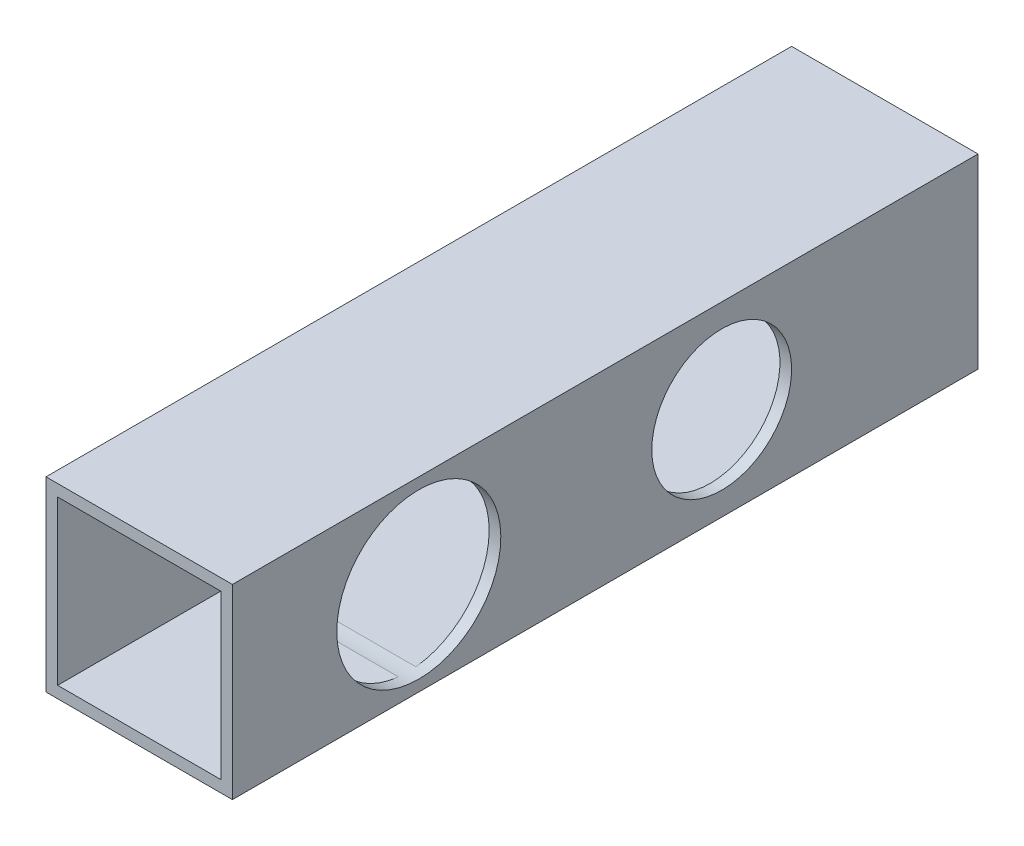
ISO-10303-21;
HEADER;
FILE_DESCRIPTION(('STEP AP214'),'2;1');
FILE_NAME('part.step','',(''),(''),'','','');
FILE_SCHEMA(('AUTOMOTIVE_DESIGN { 1 0 10303 214 1 1 1 1 }'));
ENDSEC;
DATA;
#1=APPLICATION_CONTEXT('core data for automotive mechanical design processes');
#2=APPLICATION_PROTOCOL_DEFINITION('international standard','automotive_design',2000,#1);
#3=PRODUCT_CONTEXT('',#1,'mechanical');
#4=PRODUCT('Part','Part','',(#3));
#5=PRODUCT_RELATED_PRODUCT_CATEGORY('part','',(#4));
#6=PRODUCT_DEFINITION_FORMATION('','',#4);
#7=PRODUCT_DEFINITION_CONTEXT('part definition',#1,'design');
#8=PRODUCT_DEFINITION('design','',#6,#7);
#9=PRODUCT_DEFINITION_SHAPE('','',#8);
#10=(LENGTH_UNIT() NAMED_UNIT(*) SI_UNIT(.MILLI.,.METRE.));
#11=(NAMED_UNIT(*) PLANE_ANGLE_UNIT() SI_UNIT($,.RADIAN.));
#12=(NAMED_UNIT(*) SI_UNIT($,.STERADIAN.) SOLID_ANGLE_UNIT());
#13=UNCERTAINTY_MEASURE_WITH_UNIT(LENGTH_MEASURE(1.E-05),#10,'distance_accuracy_value','');
#14=(GEOMETRIC_REPRESENTATION_CONTEXT(3) GLOBAL_UNCERTAINTY_ASSIGNED_CONTEXT((#13)) GLOBAL_UNIT_ASSIGNED_CONTEXT((#10,
#11,#12)) REPRESENTATION_CONTEXT('',''));
#15=CARTESIAN_POINT('',(0.,0.,0.));
#16=DIRECTION('',(0.,0.,1.));
#17=DIRECTION('',(1.,0.,0.));
#18=AXIS2_PLACEMENT_3D('',#15,#16,#17);
#19=CARTESIAN_POINT('',(11.1125,-11.1125,914.4));
#20=DIRECTION('',(-1.,0.,0.));
#21=DIRECTION('',(0.,0.,1.));
#22=AXIS2_PLACEMENT_3D('',#19,#20,#21);
#23=PLANE('',#22);
#24=CARTESIAN_POINT('',(11.1125,0.,-879.475));
#25=DIRECTION('',(-1.,0.,0.));
#26=DIRECTION('',(0.,0.,1.));
#27=AXIS2_PLACEMENT_3D('',#24,#25,#26);
#28=CIRCLE('',#27,9.52500000000002);
#29=CARTESIAN_POINT('',(11.1125,0.,-869.95));
#30=VERTEX_POINT('',#29);
#31=EDGE_CURVE('E363',#30,#30,#28,.T.);
#32=ORIENTED_EDGE('',*,*,#31,.F.);
#33=EDGE_LOOP('',(#32));
#34=FACE_BOUND('',#33,.T.);
#35=CARTESIAN_POINT('',(11.1125,0.,-838.2));
#36=DIRECTION('',(-1.,0.,0.));
#37=DIRECTION('',(0.,0.,1.));
#38=AXIS2_PLACEMENT_3D('',#35,#36,#37);
#39=CIRCLE('',#38,11.1759999999999);
#40=CARTESIAN_POINT('',(11.1125,11.1125,-839.389672118694));
#41=VERTEX_POINT('',#40);
#42=CARTESIAN_POINT('',(11.1125,-11.1125,-839.389672118694));
#43=VERTEX_POINT('',#42);
#44=EDGE_CURVE('E133',#41,#43,#39,.T.);
#45=ORIENTED_EDGE('',*,*,#44,.F.);
#46=DIRECTION('',(0.,0.,-1.));
#47=VECTOR('',#46,1.);
#48=CARTESIAN_POINT('',(11.1125,11.1125,914.4));
#49=LINE('',#48,#47);
#50=CARTESIAN_POINT('',(11.1125,11.1125,-914.4));
#51=VERTEX_POINT('',#50);
#52=EDGE_CURVE('E162',#41,#51,#49,.T.);
#53=ORIENTED_EDGE('',*,*,#52,.T.);
#54=DIRECTION('',(0.,1.,0.));
#55=VECTOR('',#54,1.);
#56=CARTESIAN_POINT('',(11.1125,-11.1125,-914.4));
#57=LINE('',#56,#55);
#58=CARTESIAN_POINT('',(11.1125,-11.1125,-914.4));
#59=VERTEX_POINT('',#58);
#60=EDGE_CURVE('E191',#59,#51,#57,.T.);
#61=ORIENTED_EDGE('',*,*,#60,.F.);
#62=DIRECTION('',(0.,0.,-1.));
#63=VECTOR('',#62,1.);
#64=CARTESIAN_POINT('',(11.1125,-11.1125,914.4));
#65=LINE('',#64,#63);
#66=EDGE_CURVE('E235',#43,#59,#65,.T.);
#67=ORIENTED_EDGE('',*,*,#66,.F.);
#68=EDGE_LOOP('',(#45,#53,#61,#67));
#69=FACE_BOUND('',#68,.T.);
#70=ADVANCED_FACE('F38',(#34,#69),#23,.T.);
#71=CARTESIAN_POINT('',(-11.1125,11.1125,914.4));
#72=DIRECTION('',(0.,-1.,0.));
#73=DIRECTION('',(0.,0.,-1.));
#74=AXIS2_PLACEMENT_3D('',#71,#72,#73);
#75=PLANE('',#74);
#76=DIRECTION('',(1.,0.,0.));
#77=VECTOR('',#76,1.);
#78=CARTESIAN_POINT('',(-42.7230015461633,11.1125,-839.389672118694));
#79=LINE('',#78,#77);
#80=CARTESIAN_POINT('',(-11.1125,11.1125,-839.389672118694));
#81=VERTEX_POINT('',#80);
#82=EDGE_CURVE('E312',#81,#41,#79,.T.);
#83=ORIENTED_EDGE('',*,*,#82,.F.);
#84=DIRECTION('',(0.,0.,-1.));
#85=VECTOR('',#84,1.);
#86=CARTESIAN_POINT('',(-11.1125,11.1125,914.4));
#87=LINE('',#86,#85);
#88=CARTESIAN_POINT('',(-11.1125,11.1125,-914.4));
#89=VERTEX_POINT('',#88);
#90=EDGE_CURVE('E150',#81,#89,#87,.T.);
#91=ORIENTED_EDGE('',*,*,#90,.T.);
#92=DIRECTION('',(-1.,0.,0.));
#93=VECTOR('',#92,1.);
#94=CARTESIAN_POINT('',(-11.1125,11.1125,-914.4));
#95=LINE('',#94,#93);
#96=EDGE_CURVE('E196',#51,#89,#95,.T.);
#97=ORIENTED_EDGE('',*,*,#96,.F.);
#98=ORIENTED_EDGE('',*,*,#52,.F.);
#99=EDGE_LOOP('',(#83,#91,#97,#98));
#100=FACE_BOUND('',#99,.T.);
#101=ADVANCED_FACE('F197',(#100),#75,.T.);
#102=CARTESIAN_POINT('',(-11.1125,-11.1125,914.4));
#103=DIRECTION('',(0.,1.,0.));
#104=DIRECTION('',(0.,0.,1.));
#105=AXIS2_PLACEMENT_3D('',#102,#103,#104);
#106=PLANE('',#105);
#107=DIRECTION('',(1.,0.,0.));
#108=VECTOR('',#107,1.);
#109=CARTESIAN_POINT('',(-42.7230015461633,-11.1125,-837.010327881306));
#110=LINE('',#109,#108);
#111=CARTESIAN_POINT('',(-11.1125,-11.1125,-837.010327881306));
#112=VERTEX_POINT('',#111);
#113=CARTESIAN_POINT('',(11.1125,-11.1125,-837.010327881306));
#114=VERTEX_POINT('',#113);
#115=EDGE_CURVE('E11',#112,#114,#110,.T.);
#116=ORIENTED_EDGE('',*,*,#115,.F.);
#117=DIRECTION('',(0.,0.,-1.));
#118=VECTOR('',#117,1.);
#119=CARTESIAN_POINT('',(-11.1125,-11.1125,914.4));
#120=LINE('',#119,#118);
#121=CARTESIAN_POINT('',(-11.1125,-11.1125,-812.8));
#122=VERTEX_POINT('',#121);
#123=EDGE_CURVE('E141',#122,#112,#120,.T.);
#124=ORIENTED_EDGE('',*,*,#123,.F.);
#125=DIRECTION('',(-1.,0.,0.));
#126=VECTOR('',#125,1.);
#127=CARTESIAN_POINT('',(-11.1125,-11.1125,-812.8));
#128=LINE('',#127,#126);
#129=CARTESIAN_POINT('',(11.1125,-11.1125,-812.799999999999));
#130=VERTEX_POINT('',#129);
#131=EDGE_CURVE('E179',#130,#122,#128,.T.);
#132=ORIENTED_EDGE('',*,*,#131,.F.);
#133=EDGE_CURVE('E143',#130,#114,#65,.T.);
#134=ORIENTED_EDGE('',*,*,#133,.T.);
#135=EDGE_LOOP('',(#116,#124,#132,#134));
#136=FACE_BOUND('',#135,.T.);
#137=ADVANCED_FACE('F139',(#136),#106,.T.);
#138=CARTESIAN_POINT('',(12.7,-12.7,914.4));
#139=DIRECTION('',(-1.,0.,0.));
#140=DIRECTION('',(0.,0.,1.));
#141=AXIS2_PLACEMENT_3D('',#138,#139,#140);
#142=PLANE('',#141);
#143=CARTESIAN_POINT('',(12.7,0.,-879.475));
#144=DIRECTION('',(-1.,0.,0.));
#145=DIRECTION('',(0.,0.,1.));
#146=AXIS2_PLACEMENT_3D('',#143,#144,#145);
#147=CIRCLE('',#146,9.52500000000002);
#148=CARTESIAN_POINT('',(12.7,0.,-869.95));
#149=VERTEX_POINT('',#148);
#150=EDGE_CURVE('E261',#149,#149,#147,.T.);
#151=ORIENTED_EDGE('',*,*,#150,.T.);
#152=EDGE_LOOP('',(#151));
#153=FACE_BOUND('',#152,.T.);
#154=CARTESIAN_POINT('',(12.7,0.,-838.2));
#155=DIRECTION('',(-1.,0.,0.));
#156=DIRECTION('',(0.,0.,1.));
#157=AXIS2_PLACEMENT_3D('',#154,#155,#156);
#158=CIRCLE('',#157,11.1759999999999);
#159=CARTESIAN_POINT('',(12.7,0.,-827.024));
#160=VERTEX_POINT('',#159);
#161=EDGE_CURVE('E316',#160,#160,#158,.T.);
#162=ORIENTED_EDGE('',*,*,#161,.T.);
#163=EDGE_LOOP('',(#162));
#164=FACE_BOUND('',#163,.T.);
#165=DIRECTION('',(0.,0.,-1.));
#166=VECTOR('',#165,1.);
#167=CARTESIAN_POINT('',(12.7,12.7,914.4));
#168=LINE('',#167,#166);
#169=CARTESIAN_POINT('',(12.7,12.7,-812.8));
#170=VERTEX_POINT('',#169);
#171=CARTESIAN_POINT('',(12.7,12.7,-914.4));
#172=VERTEX_POINT('',#171);
#173=EDGE_CURVE('E176',#170,#172,#168,.T.);
#174=ORIENTED_EDGE('',*,*,#173,.F.);
#175=DIRECTION('',(0.,-1.,0.));
#176=VECTOR('',#175,1.);
#177=CARTESIAN_POINT('',(12.7,-12.7,-812.8));
#178=LINE('',#177,#176);
#179=CARTESIAN_POINT('',(12.7,-12.7,-812.8));
#180=VERTEX_POINT('',#179);
#181=EDGE_CURVE('E209',#170,#180,#178,.T.);
#182=ORIENTED_EDGE('',*,*,#181,.T.);
#183=DIRECTION('',(0.,0.,-1.));
#184=VECTOR('',#183,1.);
#185=CARTESIAN_POINT('',(12.7,-12.7,914.4));
#186=LINE('',#185,#184);
#187=CARTESIAN_POINT('',(12.7,-12.7,-914.4));
#188=VERTEX_POINT('',#187);
#189=EDGE_CURVE('E167',#180,#188,#186,.T.);
#190=ORIENTED_EDGE('',*,*,#189,.T.);
#191=DIRECTION('',(0.,1.,0.));
#192=VECTOR('',#191,1.);
#193=CARTESIAN_POINT('',(12.7,-12.7,-914.4));
#194=LINE('',#193,#192);
#195=EDGE_CURVE('E221',#188,#172,#194,.T.);
#196=ORIENTED_EDGE('',*,*,#195,.T.);
#197=EDGE_LOOP('',(#174,#182,#190,#196));
#198=FACE_BOUND('',#197,.T.);
#199=ADVANCED_FACE('F40',(#153,#164,#198),#142,.F.);
#200=CARTESIAN_POINT('',(-12.7,12.7,914.4));
#201=DIRECTION('',(0.,-1.,0.));
#202=DIRECTION('',(0.,0.,-1.));
#203=AXIS2_PLACEMENT_3D('',#200,#201,#202);
#204=PLANE('',#203);
#205=DIRECTION('',(0.,0.,-1.));
#206=VECTOR('',#205,1.);
#207=CARTESIAN_POINT('',(-12.7,12.7,914.4));
#208=LINE('',#207,#206);
#209=CARTESIAN_POINT('',(-12.7,12.7,-812.8));
#210=VERTEX_POINT('',#209);
#211=CARTESIAN_POINT('',(-12.7,12.7,-914.4));
#212=VERTEX_POINT('',#211);
#213=EDGE_CURVE('E173',#210,#212,#208,.T.);
#214=ORIENTED_EDGE('',*,*,#213,.F.);
#215=DIRECTION('',(1.,0.,0.));
#216=VECTOR('',#215,1.);
#217=CARTESIAN_POINT('',(-12.7,12.7,-812.8));
#218=LINE('',#217,#216);
#219=EDGE_CURVE('E213',#210,#170,#218,.T.);
#220=ORIENTED_EDGE('',*,*,#219,.T.);
#221=ORIENTED_EDGE('',*,*,#173,.T.);
#222=DIRECTION('',(-1.,0.,0.));
#223=VECTOR('',#222,1.);
#224=CARTESIAN_POINT('',(-12.7,12.7,-914.4));
#225=LINE('',#224,#223);
#226=EDGE_CURVE('E225',#172,#212,#225,.T.);
#227=ORIENTED_EDGE('',*,*,#226,.T.);
#228=EDGE_LOOP('',(#214,#220,#221,#227));
#229=FACE_BOUND('',#228,.T.);
#230=ADVANCED_FACE('F273',(#229),#204,.F.);
#231=CARTESIAN_POINT('',(-12.7,-12.7,914.4));
#232=DIRECTION('',(1.,0.,0.));
#233=DIRECTION('',(0.,0.,-1.));
#234=AXIS2_PLACEMENT_3D('',#231,#232,#233);
#235=PLANE('',#234);
#236=CARTESIAN_POINT('',(-12.7,0.,-879.475));
#237=DIRECTION('',(1.,0.,0.));
#238=DIRECTION('',(0.,0.,-1.));
#239=AXIS2_PLACEMENT_3D('',#236,#237,#238);
#240=CIRCLE('',#239,3.17500000000008);
#241=CARTESIAN_POINT('',(-12.7,0.,-882.65));
#242=VERTEX_POINT('',#241);
#243=EDGE_CURVE('E323',#242,#242,#240,.T.);
#244=ORIENTED_EDGE('',*,*,#243,.T.);
#245=EDGE_LOOP('',(#244));
#246=FACE_BOUND('',#245,.T.);
#247=DIRECTION('',(0.,0.,-1.));
#248=VECTOR('',#247,1.);
#249=CARTESIAN_POINT('',(-12.7,-12.7,914.4));
#250=LINE('',#249,#248);
#251=CARTESIAN_POINT('',(-12.7,-12.7,-812.799999999999));
#252=VERTEX_POINT('',#251);
#253=CARTESIAN_POINT('',(-12.7,-12.7,-914.4));
#254=VERTEX_POINT('',#253);
#255=EDGE_CURVE('E170',#252,#254,#250,.T.);
#256=ORIENTED_EDGE('',*,*,#255,.F.);
#257=DIRECTION('',(0.,1.,0.));
#258=VECTOR('',#257,1.);
#259=CARTESIAN_POINT('',(-12.7,-12.7,-812.8));
#260=LINE('',#259,#258);
#261=EDGE_CURVE('E63',#252,#210,#260,.T.);
#262=ORIENTED_EDGE('',*,*,#261,.T.);
#263=ORIENTED_EDGE('',*,*,#213,.T.);
#264=DIRECTION('',(0.,-1.,0.));
#265=VECTOR('',#264,1.);
#266=CARTESIAN_POINT('',(-12.7,-12.7,-914.4));
#267=LINE('',#266,#265);
#268=EDGE_CURVE('E229',#212,#254,#267,.T.);
#269=ORIENTED_EDGE('',*,*,#268,.T.);
#270=EDGE_LOOP('',(#256,#262,#263,#269));
#271=FACE_BOUND('',#270,.T.);
#272=ADVANCED_FACE('F280',(#246,#271),#235,.F.);
#273=CARTESIAN_POINT('',(-12.7,-12.7,914.4));
#274=DIRECTION('',(0.,1.,0.));
#275=DIRECTION('',(0.,0.,1.));
#276=AXIS2_PLACEMENT_3D('',#273,#274,#275);
#277=PLANE('',#276);
#278=ORIENTED_EDGE('',*,*,#189,.F.);
#279=DIRECTION('',(-1.,0.,0.));
#280=VECTOR('',#279,1.);
#281=CARTESIAN_POINT('',(-12.7,-12.7,-812.8));
#282=LINE('',#281,#280);
#283=EDGE_CURVE('E259',#180,#252,#282,.T.);
#284=ORIENTED_EDGE('',*,*,#283,.T.);
#285=ORIENTED_EDGE('',*,*,#255,.T.);
#286=DIRECTION('',(1.,0.,0.));
#287=VECTOR('',#286,1.);
#288=CARTESIAN_POINT('',(-12.7,-12.7,-914.4));
#289=LINE('',#288,#287);
#290=EDGE_CURVE('E232',#254,#188,#289,.T.);
#291=ORIENTED_EDGE('',*,*,#290,.T.);
#292=EDGE_LOOP('',(#278,#284,#285,#291));
#293=FACE_BOUND('',#292,.T.);
#294=ADVANCED_FACE('F281',(#293),#277,.F.);
#295=CARTESIAN_POINT('',(11.1125,11.1125,-837.010327881306));
#296=VERTEX_POINT('',#295);
#297=EDGE_CURVE('E310',#114,#296,#39,.T.);
#298=ORIENTED_EDGE('',*,*,#297,.F.);
#299=ORIENTED_EDGE('',*,*,#133,.F.);
#300=DIRECTION('',(0.,-1.,0.));
#301=VECTOR('',#300,1.);
#302=CARTESIAN_POINT('',(11.1125,-11.1125,-812.8));
#303=LINE('',#302,#301);
#304=CARTESIAN_POINT('',(11.1125,11.1125,-812.8));
#305=VERTEX_POINT('',#304);
#306=EDGE_CURVE('E255',#305,#130,#303,.T.);
#307=ORIENTED_EDGE('',*,*,#306,.F.);
#308=EDGE_CURVE('E163',#305,#296,#49,.T.);
#309=ORIENTED_EDGE('',*,*,#308,.T.);
#310=EDGE_LOOP('',(#298,#299,#307,#309));
#311=FACE_BOUND('',#310,.T.);
#312=ADVANCED_FACE('F296',(#311),#23,.T.);
#313=DIRECTION('',(1.,0.,0.));
#314=VECTOR('',#313,1.);
#315=CARTESIAN_POINT('',(-42.7230015461633,11.1125,-837.010327881306));
#316=LINE('',#315,#314);
#317=CARTESIAN_POINT('',(-11.1125,11.1125,-837.010327881306));
#318=VERTEX_POINT('',#317);
#319=EDGE_CURVE('E250',#296,#318,#316,.F.);
#320=ORIENTED_EDGE('',*,*,#319,.F.);
#321=ORIENTED_EDGE('',*,*,#308,.F.);
#322=DIRECTION('',(1.,0.,0.));
#323=VECTOR('',#322,1.);
#324=CARTESIAN_POINT('',(-11.1125,11.1125,-812.8));
#325=LINE('',#324,#323);
#326=CARTESIAN_POINT('',(-11.1125,11.1125,-812.8));
#327=VERTEX_POINT('',#326);
#328=EDGE_CURVE('E251',#327,#305,#325,.T.);
#329=ORIENTED_EDGE('',*,*,#328,.F.);
#330=EDGE_CURVE('E155',#327,#318,#87,.T.);
#331=ORIENTED_EDGE('',*,*,#330,.T.);
#332=EDGE_LOOP('',(#320,#321,#329,#331));
#333=FACE_BOUND('',#332,.T.);
#334=ADVANCED_FACE('F248',(#333),#75,.T.);
#335=CARTESIAN_POINT('',(-11.1125,-11.1125,914.4));
#336=DIRECTION('',(1.,0.,0.));
#337=DIRECTION('',(0.,0.,-1.));
#338=AXIS2_PLACEMENT_3D('',#335,#336,#337);
#339=PLANE('',#338);
#340=CARTESIAN_POINT('',(-11.1125,0.,-879.475));
#341=DIRECTION('',(1.,0.,0.));
#342=DIRECTION('',(0.,0.,-1.));
#343=AXIS2_PLACEMENT_3D('',#340,#341,#342);
#344=CIRCLE('',#343,3.17500000000008);
#345=CARTESIAN_POINT('',(-11.1125,0.,-882.65));
#346=VERTEX_POINT('',#345);
#347=EDGE_CURVE('E42',#346,#346,#344,.T.);
#348=ORIENTED_EDGE('',*,*,#347,.F.);
#349=EDGE_LOOP('',(#348));
#350=FACE_BOUND('',#349,.T.);
#351=ORIENTED_EDGE('',*,*,#90,.F.);
#352=CARTESIAN_POINT('',(-11.1125,0.,-838.2));
#353=DIRECTION('',(1.,0.,0.));
#354=DIRECTION('',(0.,0.,-1.));
#355=AXIS2_PLACEMENT_3D('',#352,#353,#354);
#356=CIRCLE('',#355,11.1759999999999);
#357=EDGE_CURVE('E134',#318,#81,#356,.F.);
#358=ORIENTED_EDGE('',*,*,#357,.F.);
#359=ORIENTED_EDGE('',*,*,#330,.F.);
#360=DIRECTION('',(0.,1.,0.));
#361=VECTOR('',#360,1.);
#362=CARTESIAN_POINT('',(-11.1125,-11.1125,-812.8));
#363=LINE('',#362,#361);
#364=EDGE_CURVE('E148',#122,#327,#363,.T.);
#365=ORIENTED_EDGE('',*,*,#364,.F.);
#366=ORIENTED_EDGE('',*,*,#123,.T.);
#367=CARTESIAN_POINT('',(-11.1125,-11.1125,-839.389672118694));
#368=VERTEX_POINT('',#367);
#369=EDGE_CURVE('E55',#368,#112,#356,.F.);
#370=ORIENTED_EDGE('',*,*,#369,.F.);
#371=CARTESIAN_POINT('',(-11.1125,-11.1125,-914.4));
#372=VERTEX_POINT('',#371);
#373=EDGE_CURVE('E151',#368,#372,#120,.T.);
#374=ORIENTED_EDGE('',*,*,#373,.T.);
#375=DIRECTION('',(0.,-1.,0.));
#376=VECTOR('',#375,1.);
#377=CARTESIAN_POINT('',(-11.1125,-11.1125,-914.4));
#378=LINE('',#377,#376);
#379=EDGE_CURVE('E202',#89,#372,#378,.T.);
#380=ORIENTED_EDGE('',*,*,#379,.F.);
#381=EDGE_LOOP('',(#351,#358,#359,#365,#366,#370,#374,#380));
#382=FACE_BOUND('',#381,.T.);
#383=ADVANCED_FACE('F146',(#350,#382),#339,.T.);
#384=DIRECTION('',(1.,0.,0.));
#385=VECTOR('',#384,1.);
#386=CARTESIAN_POINT('',(-42.7230015461633,-11.1125,-839.389672118694));
#387=LINE('',#386,#385);
#388=EDGE_CURVE('E48',#43,#368,#387,.F.);
#389=ORIENTED_EDGE('',*,*,#388,.F.);
#390=ORIENTED_EDGE('',*,*,#66,.T.);
#391=DIRECTION('',(1.,0.,0.));
#392=VECTOR('',#391,1.);
#393=CARTESIAN_POINT('',(-11.1125,-11.1125,-914.4));
#394=LINE('',#393,#392);
#395=EDGE_CURVE('E207',#372,#59,#394,.T.);
#396=ORIENTED_EDGE('',*,*,#395,.F.);
#397=ORIENTED_EDGE('',*,*,#373,.F.);
#398=EDGE_LOOP('',(#389,#390,#396,#397));
#399=FACE_BOUND('',#398,.T.);
#400=ADVANCED_FACE('F242',(#399),#106,.T.);
#401=CARTESIAN_POINT('',(0.,0.,-914.4));
#402=DIRECTION('',(0.,0.,-1.));
#403=DIRECTION('',(-1.,0.,0.));
#404=AXIS2_PLACEMENT_3D('',#401,#402,#403);
#405=PLANE('',#404);
#406=ORIENTED_EDGE('',*,*,#60,.T.);
#407=ORIENTED_EDGE('',*,*,#96,.T.);
#408=ORIENTED_EDGE('',*,*,#379,.T.);
#409=ORIENTED_EDGE('',*,*,#395,.T.);
#410=EDGE_LOOP('',(#406,#407,#408,#409));
#411=FACE_BOUND('',#410,.T.);
#412=ORIENTED_EDGE('',*,*,#195,.F.);
#413=ORIENTED_EDGE('',*,*,#290,.F.);
#414=ORIENTED_EDGE('',*,*,#268,.F.);
#415=ORIENTED_EDGE('',*,*,#226,.F.);
#416=EDGE_LOOP('',(#412,#413,#414,#415));
#417=FACE_BOUND('',#416,.T.);
#418=ADVANCED_FACE('F204',(#411,#417),#405,.T.);
#419=CARTESIAN_POINT('',(0.,0.,-812.8));
#420=DIRECTION('',(0.,0.,-1.));
#421=DIRECTION('',(-1.,0.,0.));
#422=AXIS2_PLACEMENT_3D('',#419,#420,#421);
#423=PLANE('',#422);
#424=ORIENTED_EDGE('',*,*,#306,.T.);
#425=ORIENTED_EDGE('',*,*,#131,.T.);
#426=ORIENTED_EDGE('',*,*,#364,.T.);
#427=ORIENTED_EDGE('',*,*,#328,.T.);
#428=EDGE_LOOP('',(#424,#425,#426,#427));
#429=FACE_BOUND('',#428,.T.);
#430=ORIENTED_EDGE('',*,*,#219,.F.);
#431=ORIENTED_EDGE('',*,*,#261,.F.);
#432=ORIENTED_EDGE('',*,*,#283,.F.);
#433=ORIENTED_EDGE('',*,*,#181,.F.);
#434=EDGE_LOOP('',(#430,#431,#432,#433));
#435=FACE_BOUND('',#434,.T.);
#436=ADVANCED_FACE('F282',(#429,#435),#423,.F.);
#437=CARTESIAN_POINT('',(-42.7230015461633,0.,-838.2));
#438=DIRECTION('',(1.,0.,0.));
#439=DIRECTION('',(0.,0.,-1.));
#440=AXIS2_PLACEMENT_3D('',#437,#438,#439);
#441=CYLINDRICAL_SURFACE('',#440,11.1759999999999);
#442=ORIENTED_EDGE('',*,*,#319,.T.);
#443=ORIENTED_EDGE('',*,*,#357,.T.);
#444=ORIENTED_EDGE('',*,*,#82,.T.);
#445=ORIENTED_EDGE('',*,*,#44,.T.);
#446=ORIENTED_EDGE('',*,*,#388,.T.);
#447=ORIENTED_EDGE('',*,*,#369,.T.);
#448=ORIENTED_EDGE('',*,*,#115,.T.);
#449=ORIENTED_EDGE('',*,*,#297,.T.);
#450=EDGE_LOOP('',(#442,#443,#444,#445,#446,#447,#448,#449));
#451=FACE_BOUND('',#450,.T.);
#452=ORIENTED_EDGE('',*,*,#161,.F.);
#453=EDGE_LOOP('',(#452));
#454=FACE_BOUND('',#453,.T.);
#455=ADVANCED_FACE('F127',(#451,#454),#441,.F.);
#456=CARTESIAN_POINT('',(-42.7230015461633,0.,-879.475));
#457=DIRECTION('',(1.,0.,0.));
#458=DIRECTION('',(0.,0.,-1.));
#459=AXIS2_PLACEMENT_3D('',#456,#457,#458);
#460=CYLINDRICAL_SURFACE('',#459,9.52500000000002);
#461=ORIENTED_EDGE('',*,*,#31,.T.);
#462=EDGE_LOOP('',(#461));
#463=FACE_BOUND('',#462,.T.);
#464=ORIENTED_EDGE('',*,*,#150,.F.);
#465=EDGE_LOOP('',(#464));
#466=FACE_BOUND('',#465,.T.);
#467=ADVANCED_FACE('F290',(#463,#466),#460,.F.);
#468=CARTESIAN_POINT('',(-12.7,0.,-879.475));
#469=DIRECTION('',(1.,0.,0.));
#470=DIRECTION('',(0.,0.,-1.));
#471=AXIS2_PLACEMENT_3D('',#468,#469,#470);
#472=CYLINDRICAL_SURFACE('',#471,3.17500000000008);
#473=ORIENTED_EDGE('',*,*,#347,.T.);
#474=EDGE_LOOP('',(#473));
#475=FACE_BOUND('',#474,.T.);
#476=ORIENTED_EDGE('',*,*,#243,.F.);
#477=EDGE_LOOP('',(#476));
#478=FACE_BOUND('',#477,.T.);
#479=ADVANCED_FACE('F329',(#475,#478),#472,.F.);
#480=CLOSED_SHELL('',(#70,#101,#137,#199,#230,#272,#294,#312,#334,#383,#400,#418,#436,#455,#467,#479));
#481=MANIFOLD_SOLID_BREP('B2',#480);
#482=ADVANCED_BREP_SHAPE_REPRESENTATION('',(#18,#481),#14);
#483=SHAPE_DEFINITION_REPRESENTATION(#9,#482);
ENDSEC;
END-ISO-10303-21;
